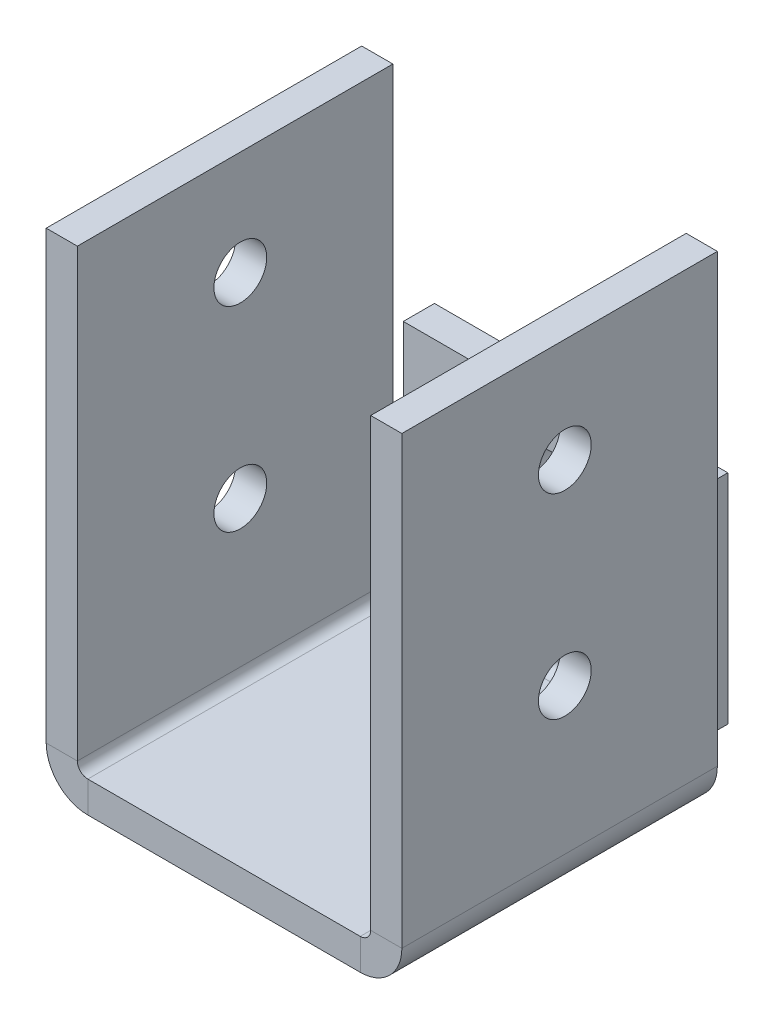
ISO-10303-21;
HEADER;
FILE_DESCRIPTION(('STEP AP214'),'2;1');
FILE_NAME('part.step','',(''),(''),'','','');
FILE_SCHEMA(('AUTOMOTIVE_DESIGN { 1 0 10303 214 1 1 1 1 }'));
ENDSEC;
DATA;
#1=APPLICATION_CONTEXT('core data for automotive mechanical design processes');
#2=APPLICATION_PROTOCOL_DEFINITION('international standard','automotive_design',2000,#1);
#3=PRODUCT_CONTEXT('',#1,'mechanical');
#4=PRODUCT('Part','Part','',(#3));
#5=PRODUCT_RELATED_PRODUCT_CATEGORY('part','',(#4));
#6=PRODUCT_DEFINITION_FORMATION('','',#4);
#7=PRODUCT_DEFINITION_CONTEXT('part definition',#1,'design');
#8=PRODUCT_DEFINITION('design','',#6,#7);
#9=PRODUCT_DEFINITION_SHAPE('','',#8);
#10=(LENGTH_UNIT() NAMED_UNIT(*) SI_UNIT(.MILLI.,.METRE.));
#11=(NAMED_UNIT(*) PLANE_ANGLE_UNIT() SI_UNIT($,.RADIAN.));
#12=(NAMED_UNIT(*) SI_UNIT($,.STERADIAN.) SOLID_ANGLE_UNIT());
#13=UNCERTAINTY_MEASURE_WITH_UNIT(LENGTH_MEASURE(1.E-05),#10,'distance_accuracy_value','');
#14=(GEOMETRIC_REPRESENTATION_CONTEXT(3) GLOBAL_UNCERTAINTY_ASSIGNED_CONTEXT((#13)) GLOBAL_UNIT_ASSIGNED_CONTEXT((#10,
#11,#12)) REPRESENTATION_CONTEXT('',''));
#15=CARTESIAN_POINT('',(0.,0.,0.));
#16=DIRECTION('',(0.,0.,1.));
#17=DIRECTION('',(1.,0.,0.));
#18=AXIS2_PLACEMENT_3D('',#15,#16,#17);
#19=CARTESIAN_POINT('',(0.,1.59999999999982,0.));
#20=DIRECTION('',(0.,1.,0.));
#21=DIRECTION('',(0.,0.,1.));
#22=AXIS2_PLACEMENT_3D('',#19,#20,#21);
#23=PLANE('',#22);
#24=DIRECTION('',(0.,0.,-1.));
#25=VECTOR('',#24,1.);
#26=CARTESIAN_POINT('',(-20.9,1.59999999999999,-25.));
#27=LINE('',#26,#25);
#28=CARTESIAN_POINT('',(-20.9,1.59999999999999,-25.));
#29=VERTEX_POINT('',#28);
#30=CARTESIAN_POINT('',(-20.9,1.60000000000003,-29.78));
#31=VERTEX_POINT('',#30);
#32=EDGE_CURVE('E12',#29,#31,#27,.T.);
#33=ORIENTED_EDGE('',*,*,#32,.F.);
#34=DIRECTION('',(-1.,0.,0.));
#35=VECTOR('',#34,1.);
#36=CARTESIAN_POINT('',(22.5,1.59999999999999,-25.));
#37=LINE('',#36,#35);
#38=CARTESIAN_POINT('',(-22.5,1.59999999999998,-25.));
#39=VERTEX_POINT('',#38);
#40=EDGE_CURVE('E288',#29,#39,#37,.T.);
#41=ORIENTED_EDGE('',*,*,#40,.T.);
#42=DIRECTION('',(0.,0.,-1.));
#43=VECTOR('',#42,1.);
#44=CARTESIAN_POINT('',(-22.5,1.59999999999999,-25.));
#45=LINE('',#44,#43);
#46=CARTESIAN_POINT('',(-22.5,1.60000000000003,-29.78));
#47=VERTEX_POINT('',#46);
#48=EDGE_CURVE('E286',#39,#47,#45,.T.);
#49=ORIENTED_EDGE('',*,*,#48,.T.);
#50=DIRECTION('',(1.,0.,0.));
#51=VECTOR('',#50,1.);
#52=CARTESIAN_POINT('',(0.,1.60000000000003,-29.78));
#53=LINE('',#52,#51);
#54=EDGE_CURVE('E293',#47,#31,#53,.T.);
#55=ORIENTED_EDGE('',*,*,#54,.T.);
#56=EDGE_LOOP('',(#33,#41,#49,#55));
#57=FACE_BOUND('',#56,.T.);
#58=ADVANCED_FACE('F40',(#57),#23,.F.);
#59=CARTESIAN_POINT('',(-22.5,1.59999999999998,-23.4));
#60=DIRECTION('',(-1.,0.,0.));
#61=DIRECTION('',(0.,0.,-1.));
#62=AXIS2_PLACEMENT_3D('',#59,#60,#61);
#63=CYLINDRICAL_SURFACE('',#62,6.38);
#64=DIRECTION('',(-1.,0.,0.));
#65=VECTOR('',#64,1.);
#66=CARTESIAN_POINT('',(-22.5,-4.78000000000002,-23.4));
#67=LINE('',#66,#65);
#68=CARTESIAN_POINT('',(-20.9,-4.78,-23.4));
#69=VERTEX_POINT('',#68);
#70=CARTESIAN_POINT('',(20.9,-4.78000000000002,-23.4));
#71=VERTEX_POINT('',#70);
#72=EDGE_CURVE('E317',#69,#71,#67,.F.);
#73=ORIENTED_EDGE('',*,*,#72,.F.);
#74=CARTESIAN_POINT('',(-20.9,1.59999999999998,-23.4));
#75=DIRECTION('',(-1.,0.,0.));
#76=DIRECTION('',(0.,0.,1.));
#77=AXIS2_PLACEMENT_3D('',#74,#75,#76);
#78=CIRCLE('',#77,6.38);
#79=EDGE_CURVE('E48',#69,#31,#78,.F.);
#80=ORIENTED_EDGE('',*,*,#79,.T.);
#81=CARTESIAN_POINT('',(20.9,1.60000000000003,-29.78));
#82=VERTEX_POINT('',#81);
#83=EDGE_CURVE('E296',#31,#82,#53,.T.);
#84=ORIENTED_EDGE('',*,*,#83,.T.);
#85=CARTESIAN_POINT('',(20.9,1.59999999999998,-23.4));
#86=DIRECTION('',(1.,0.,0.));
#87=DIRECTION('',(0.,0.,-1.));
#88=AXIS2_PLACEMENT_3D('',#85,#86,#87);
#89=CIRCLE('',#88,6.38);
#90=EDGE_CURVE('E324',#82,#71,#89,.F.);
#91=ORIENTED_EDGE('',*,*,#90,.T.);
#92=EDGE_LOOP('',(#73,#80,#84,#91));
#93=FACE_BOUND('',#92,.T.);
#94=ADVANCED_FACE('F394',(#93),#63,.T.);
#95=CARTESIAN_POINT('',(-20.9,1.59999999999998,-23.4));
#96=DIRECTION('',(-1.,0.,0.));
#97=DIRECTION('',(0.,0.,1.));
#98=AXIS2_PLACEMENT_3D('',#95,#96,#97);
#99=PLANE('',#98);
#100=CARTESIAN_POINT('',(-20.9,1.59999999999998,-23.4));
#101=DIRECTION('',(-1.,0.,0.));
#102=DIRECTION('',(0.,0.,1.));
#103=AXIS2_PLACEMENT_3D('',#100,#101,#102);
#104=CIRCLE('',#103,1.6);
#105=CARTESIAN_POINT('',(-20.9,0.,-23.4));
#106=VERTEX_POINT('',#105);
#107=EDGE_CURVE('E333',#106,#29,#104,.F.);
#108=ORIENTED_EDGE('',*,*,#107,.T.);
#109=ORIENTED_EDGE('',*,*,#32,.T.);
#110=ORIENTED_EDGE('',*,*,#79,.F.);
#111=DIRECTION('',(0.,-1.,0.));
#112=VECTOR('',#111,1.);
#113=CARTESIAN_POINT('',(-20.9,0.,-23.4));
#114=LINE('',#113,#112);
#115=EDGE_CURVE('E224',#106,#69,#114,.T.);
#116=ORIENTED_EDGE('',*,*,#115,.F.);
#117=EDGE_LOOP('',(#108,#109,#110,#116));
#118=FACE_BOUND('',#117,.T.);
#119=ADVANCED_FACE('F398',(#118),#99,.T.);
#120=CARTESIAN_POINT('',(0.,-4.78,0.));
#121=DIRECTION('',(0.,1.,0.));
#122=DIRECTION('',(0.,0.,1.));
#123=AXIS2_PLACEMENT_3D('',#120,#121,#122);
#124=PLANE('',#123);
#125=DIRECTION('',(0.,0.,1.));
#126=VECTOR('',#125,1.);
#127=CARTESIAN_POINT('',(-20.9,-4.78000000000001,25.));
#128=LINE('',#127,#126);
#129=CARTESIAN_POINT('',(-20.9,-4.78000000000001,25.));
#130=VERTEX_POINT('',#129);
#131=EDGE_CURVE('E170',#130,#69,#128,.F.);
#132=ORIENTED_EDGE('',*,*,#131,.T.);
#133=ORIENTED_EDGE('',*,*,#72,.T.);
#134=DIRECTION('',(0.,0.,-1.));
#135=VECTOR('',#134,1.);
#136=CARTESIAN_POINT('',(20.9,-4.78000000000002,-23.4));
#137=LINE('',#136,#135);
#138=CARTESIAN_POINT('',(20.9,-4.78,25.));
#139=VERTEX_POINT('',#138);
#140=EDGE_CURVE('E260',#71,#139,#137,.F.);
#141=ORIENTED_EDGE('',*,*,#140,.T.);
#142=DIRECTION('',(1.,0.,0.));
#143=VECTOR('',#142,1.);
#144=CARTESIAN_POINT('',(-22.5,-4.78,25.));
#145=LINE('',#144,#143);
#146=EDGE_CURVE('E322',#130,#139,#145,.T.);
#147=ORIENTED_EDGE('',*,*,#146,.F.);
#148=EDGE_LOOP('',(#132,#133,#141,#147));
#149=FACE_BOUND('',#148,.T.);
#150=ADVANCED_FACE('F404',(#149),#124,.F.);
#151=CARTESIAN_POINT('',(0.,0.,0.));
#152=DIRECTION('',(0.,1.,0.));
#153=DIRECTION('',(0.,0.,1.));
#154=AXIS2_PLACEMENT_3D('',#151,#152,#153);
#155=PLANE('',#154);
#156=DIRECTION('',(-1.,0.,0.));
#157=VECTOR('',#156,1.);
#158=CARTESIAN_POINT('',(-22.5,0.,-23.4));
#159=LINE('',#158,#157);
#160=CARTESIAN_POINT('',(20.9,0.,-23.4));
#161=VERTEX_POINT('',#160);
#162=EDGE_CURVE('E316',#106,#161,#159,.F.);
#163=ORIENTED_EDGE('',*,*,#162,.F.);
#164=DIRECTION('',(0.,0.,1.));
#165=VECTOR('',#164,1.);
#166=CARTESIAN_POINT('',(-20.9,0.,25.));
#167=LINE('',#166,#165);
#168=CARTESIAN_POINT('',(-20.9,0.,25.));
#169=VERTEX_POINT('',#168);
#170=EDGE_CURVE('E220',#169,#106,#167,.F.);
#171=ORIENTED_EDGE('',*,*,#170,.F.);
#172=DIRECTION('',(1.,0.,0.));
#173=VECTOR('',#172,1.);
#174=CARTESIAN_POINT('',(-22.5,0.,25.));
#175=LINE('',#174,#173);
#176=CARTESIAN_POINT('',(20.9,0.,25.));
#177=VERTEX_POINT('',#176);
#178=EDGE_CURVE('E320',#169,#177,#175,.T.);
#179=ORIENTED_EDGE('',*,*,#178,.T.);
#180=DIRECTION('',(0.,0.,-1.));
#181=VECTOR('',#180,1.);
#182=CARTESIAN_POINT('',(20.9,0.,-23.4));
#183=LINE('',#182,#181);
#184=EDGE_CURVE('E273',#161,#177,#183,.F.);
#185=ORIENTED_EDGE('',*,*,#184,.F.);
#186=EDGE_LOOP('',(#163,#171,#179,#185));
#187=FACE_BOUND('',#186,.T.);
#188=ADVANCED_FACE('F417',(#187),#155,.T.);
#189=CARTESIAN_POINT('',(-22.5,-4.78,25.));
#190=DIRECTION('',(0.,0.,1.));
#191=DIRECTION('',(1.,0.,0.));
#192=AXIS2_PLACEMENT_3D('',#189,#190,#191);
#193=PLANE('',#192);
#194=ORIENTED_EDGE('',*,*,#178,.F.);
#195=DIRECTION('',(0.,-1.,0.));
#196=VECTOR('',#195,1.);
#197=CARTESIAN_POINT('',(-20.9,0.,25.));
#198=LINE('',#197,#196);
#199=EDGE_CURVE('E216',#169,#130,#198,.T.);
#200=ORIENTED_EDGE('',*,*,#199,.T.);
#201=ORIENTED_EDGE('',*,*,#146,.T.);
#202=DIRECTION('',(0.,-1.,0.));
#203=VECTOR('',#202,1.);
#204=CARTESIAN_POINT('',(20.9,0.,25.));
#205=LINE('',#204,#203);
#206=EDGE_CURVE('E278',#177,#139,#205,.T.);
#207=ORIENTED_EDGE('',*,*,#206,.F.);
#208=EDGE_LOOP('',(#194,#200,#201,#207));
#209=FACE_BOUND('',#208,.T.);
#210=ADVANCED_FACE('F421',(#209),#193,.T.);
#211=CARTESIAN_POINT('',(0.,1.59999999999982,0.));
#212=DIRECTION('',(0.,1.,0.));
#213=DIRECTION('',(0.,0.,1.));
#214=AXIS2_PLACEMENT_3D('',#211,#212,#213);
#215=PLANE('',#214);
#216=DIRECTION('',(0.,0.,1.));
#217=VECTOR('',#216,1.);
#218=CARTESIAN_POINT('',(20.9,1.60000000000003,-29.78));
#219=LINE('',#218,#217);
#220=CARTESIAN_POINT('',(20.9,1.59999999999999,-25.));
#221=VERTEX_POINT('',#220);
#222=EDGE_CURVE('E331',#82,#221,#219,.T.);
#223=ORIENTED_EDGE('',*,*,#222,.F.);
#224=CARTESIAN_POINT('',(22.5,1.59999999999996,-29.78));
#225=VERTEX_POINT('',#224);
#226=EDGE_CURVE('E290',#82,#225,#53,.T.);
#227=ORIENTED_EDGE('',*,*,#226,.T.);
#228=DIRECTION('',(0.,0.,-1.));
#229=VECTOR('',#228,1.);
#230=CARTESIAN_POINT('',(22.5,1.59999999999999,-25.));
#231=LINE('',#230,#229);
#232=CARTESIAN_POINT('',(22.5,1.59999999999998,-25.));
#233=VERTEX_POINT('',#232);
#234=EDGE_CURVE('E281',#233,#225,#231,.T.);
#235=ORIENTED_EDGE('',*,*,#234,.F.);
#236=EDGE_CURVE('E283',#233,#221,#37,.T.);
#237=ORIENTED_EDGE('',*,*,#236,.T.);
#238=EDGE_LOOP('',(#223,#227,#235,#237));
#239=FACE_BOUND('',#238,.T.);
#240=ADVANCED_FACE('F425',(#239),#215,.F.);
#241=CARTESIAN_POINT('',(20.9,1.59999999999998,-23.4));
#242=DIRECTION('',(1.,0.,0.));
#243=DIRECTION('',(0.,0.,-1.));
#244=AXIS2_PLACEMENT_3D('',#241,#242,#243);
#245=PLANE('',#244);
#246=ORIENTED_EDGE('',*,*,#90,.F.);
#247=ORIENTED_EDGE('',*,*,#222,.T.);
#248=CARTESIAN_POINT('',(20.9,1.59999999999998,-23.4));
#249=DIRECTION('',(1.,0.,0.));
#250=DIRECTION('',(0.,0.,-1.));
#251=AXIS2_PLACEMENT_3D('',#248,#249,#250);
#252=CIRCLE('',#251,1.6);
#253=EDGE_CURVE('E328',#221,#161,#252,.F.);
#254=ORIENTED_EDGE('',*,*,#253,.T.);
#255=DIRECTION('',(0.,-1.,0.));
#256=VECTOR('',#255,1.);
#257=CARTESIAN_POINT('',(20.9,0.,-23.4));
#258=LINE('',#257,#256);
#259=EDGE_CURVE('E267',#161,#71,#258,.T.);
#260=ORIENTED_EDGE('',*,*,#259,.T.);
#261=EDGE_LOOP('',(#246,#247,#254,#260));
#262=FACE_BOUND('',#261,.T.);
#263=ADVANCED_FACE('F413',(#262),#245,.T.);
#264=CARTESIAN_POINT('',(-22.5,1.59999999999998,-23.4));
#265=DIRECTION('',(-1.,0.,0.));
#266=DIRECTION('',(0.,0.,-1.));
#267=AXIS2_PLACEMENT_3D('',#264,#265,#266);
#268=CYLINDRICAL_SURFACE('',#267,1.6);
#269=ORIENTED_EDGE('',*,*,#107,.F.);
#270=ORIENTED_EDGE('',*,*,#162,.T.);
#271=ORIENTED_EDGE('',*,*,#253,.F.);
#272=EDGE_CURVE('E287',#221,#29,#37,.T.);
#273=ORIENTED_EDGE('',*,*,#272,.T.);
#274=EDGE_LOOP('',(#269,#270,#271,#273));
#275=FACE_BOUND('',#274,.T.);
#276=ADVANCED_FACE('F410',(#275),#268,.F.);
#277=CARTESIAN_POINT('',(22.5,0.,-29.78));
#278=DIRECTION('',(-1.,0.,0.));
#279=DIRECTION('',(0.,0.,1.));
#280=AXIS2_PLACEMENT_3D('',#277,#278,#279);
#281=PLANE('',#280);
#282=ORIENTED_EDGE('',*,*,#234,.T.);
#283=DIRECTION('',(0.,-1.,0.));
#284=VECTOR('',#283,1.);
#285=CARTESIAN_POINT('',(22.5,0.,-29.78));
#286=LINE('',#285,#284);
#287=CARTESIAN_POINT('',(22.5,35.,-29.7800000000001));
#288=VERTEX_POINT('',#287);
#289=EDGE_CURVE('E297',#288,#225,#286,.T.);
#290=ORIENTED_EDGE('',*,*,#289,.F.);
#291=DIRECTION('',(0.,0.,1.));
#292=VECTOR('',#291,1.);
#293=CARTESIAN_POINT('',(22.5,35.,-29.7800000000001));
#294=LINE('',#293,#292);
#295=CARTESIAN_POINT('',(22.5,35.,-25.0000000000001));
#296=VERTEX_POINT('',#295);
#297=EDGE_CURVE('E305',#288,#296,#294,.T.);
#298=ORIENTED_EDGE('',*,*,#297,.T.);
#299=DIRECTION('',(0.,-1.,0.));
#300=VECTOR('',#299,1.);
#301=CARTESIAN_POINT('',(22.5,0.,-25.));
#302=LINE('',#301,#300);
#303=EDGE_CURVE('E295',#296,#233,#302,.T.);
#304=ORIENTED_EDGE('',*,*,#303,.T.);
#305=EDGE_LOOP('',(#282,#290,#298,#304));
#306=FACE_BOUND('',#305,.T.);
#307=ADVANCED_FACE('F408',(#306),#281,.F.);
#308=CARTESIAN_POINT('',(-22.5,35.,-29.7800000000001));
#309=DIRECTION('',(1.,0.,0.));
#310=DIRECTION('',(0.,0.,-1.));
#311=AXIS2_PLACEMENT_3D('',#308,#309,#310);
#312=PLANE('',#311);
#313=ORIENTED_EDGE('',*,*,#48,.F.);
#314=DIRECTION('',(0.,1.,0.));
#315=VECTOR('',#314,1.);
#316=CARTESIAN_POINT('',(-22.5,35.,-25.0000000000001));
#317=LINE('',#316,#315);
#318=CARTESIAN_POINT('',(-22.5,35.,-25.0000000000001));
#319=VERTEX_POINT('',#318);
#320=EDGE_CURVE('E308',#39,#319,#317,.T.);
#321=ORIENTED_EDGE('',*,*,#320,.T.);
#322=DIRECTION('',(0.,0.,1.));
#323=VECTOR('',#322,1.);
#324=CARTESIAN_POINT('',(-22.5,35.,-29.7800000000001));
#325=LINE('',#324,#323);
#326=CARTESIAN_POINT('',(-22.5,35.,-29.7800000000001));
#327=VERTEX_POINT('',#326);
#328=EDGE_CURVE('E313',#327,#319,#325,.T.);
#329=ORIENTED_EDGE('',*,*,#328,.F.);
#330=DIRECTION('',(0.,1.,0.));
#331=VECTOR('',#330,1.);
#332=CARTESIAN_POINT('',(-22.5,35.,-29.7800000000001));
#333=LINE('',#332,#331);
#334=EDGE_CURVE('E300',#47,#327,#333,.T.);
#335=ORIENTED_EDGE('',*,*,#334,.F.);
#336=EDGE_LOOP('',(#313,#321,#329,#335));
#337=FACE_BOUND('',#336,.T.);
#338=ADVANCED_FACE('F461',(#337),#312,.F.);
#339=CARTESIAN_POINT('',(0.,-1.03425454598511E-13,-29.78));
#340=DIRECTION('',(0.,0.,1.));
#341=DIRECTION('',(0.,-1.,0.));
#342=AXIS2_PLACEMENT_3D('',#339,#340,#341);
#343=PLANE('',#342);
#344=CARTESIAN_POINT('',(0.,25.,-29.7800000000001));
#345=DIRECTION('',(0.,0.,-1.));
#346=DIRECTION('',(0.,1.,0.));
#347=AXIS2_PLACEMENT_3D('',#344,#345,#346);
#348=CIRCLE('',#347,4.05);
#349=CARTESIAN_POINT('',(0.,29.05,-29.7800000000001));
#350=VERTEX_POINT('',#349);
#351=EDGE_CURVE('E555',#350,#350,#348,.T.);
#352=ORIENTED_EDGE('',*,*,#351,.F.);
#353=EDGE_LOOP('',(#352));
#354=FACE_BOUND('',#353,.T.);
#355=CARTESIAN_POINT('',(0.,9.99999999999999,-29.78));
#356=DIRECTION('',(0.,0.,-1.));
#357=DIRECTION('',(0.,1.,0.));
#358=AXIS2_PLACEMENT_3D('',#355,#356,#357);
#359=CIRCLE('',#358,4.05);
#360=CARTESIAN_POINT('',(0.,14.05,-29.7800000000001));
#361=VERTEX_POINT('',#360);
#362=EDGE_CURVE('E562',#361,#361,#359,.T.);
#363=ORIENTED_EDGE('',*,*,#362,.F.);
#364=EDGE_LOOP('',(#363));
#365=FACE_BOUND('',#364,.T.);
#366=ORIENTED_EDGE('',*,*,#54,.F.);
#367=ORIENTED_EDGE('',*,*,#334,.T.);
#368=DIRECTION('',(1.,0.,0.));
#369=VECTOR('',#368,1.);
#370=CARTESIAN_POINT('',(22.5,35.,-29.7800000000001));
#371=LINE('',#370,#369);
#372=EDGE_CURVE('E303',#327,#288,#371,.T.);
#373=ORIENTED_EDGE('',*,*,#372,.T.);
#374=ORIENTED_EDGE('',*,*,#289,.T.);
#375=ORIENTED_EDGE('',*,*,#226,.F.);
#376=ORIENTED_EDGE('',*,*,#83,.F.);
#377=EDGE_LOOP('',(#366,#367,#373,#374,#375,#376));
#378=FACE_BOUND('',#377,.T.);
#379=ADVANCED_FACE('F443',(#354,#365,#378),#343,.F.);
#380=CARTESIAN_POINT('',(0.,0.,-25.));
#381=DIRECTION('',(0.,0.,1.));
#382=DIRECTION('',(0.,-1.,0.));
#383=AXIS2_PLACEMENT_3D('',#380,#381,#382);
#384=PLANE('',#383);
#385=CARTESIAN_POINT('',(0.,25.,-25.0000000000001));
#386=DIRECTION('',(0.,0.,1.));
#387=DIRECTION('',(0.,-1.,0.));
#388=AXIS2_PLACEMENT_3D('',#385,#386,#387);
#389=CIRCLE('',#388,4.05);
#390=CARTESIAN_POINT('',(0.,20.95,-25.0000000000001));
#391=VERTEX_POINT('',#390);
#392=EDGE_CURVE('E356',#391,#391,#389,.F.);
#393=ORIENTED_EDGE('',*,*,#392,.T.);
#394=EDGE_LOOP('',(#393));
#395=FACE_BOUND('',#394,.T.);
#396=CARTESIAN_POINT('',(0.,10.,-25.));
#397=DIRECTION('',(0.,0.,1.));
#398=DIRECTION('',(0.,-1.,0.));
#399=AXIS2_PLACEMENT_3D('',#396,#397,#398);
#400=CIRCLE('',#399,4.05);
#401=CARTESIAN_POINT('',(0.,5.95,-25.));
#402=VERTEX_POINT('',#401);
#403=EDGE_CURVE('E559',#402,#402,#400,.F.);
#404=ORIENTED_EDGE('',*,*,#403,.T.);
#405=EDGE_LOOP('',(#404));
#406=FACE_BOUND('',#405,.T.);
#407=ORIENTED_EDGE('',*,*,#320,.F.);
#408=ORIENTED_EDGE('',*,*,#40,.F.);
#409=ORIENTED_EDGE('',*,*,#272,.F.);
#410=ORIENTED_EDGE('',*,*,#236,.F.);
#411=ORIENTED_EDGE('',*,*,#303,.F.);
#412=DIRECTION('',(1.,0.,0.));
#413=VECTOR('',#412,1.);
#414=CARTESIAN_POINT('',(22.5,35.,-25.0000000000001));
#415=LINE('',#414,#413);
#416=EDGE_CURVE('E301',#319,#296,#415,.T.);
#417=ORIENTED_EDGE('',*,*,#416,.F.);
#418=EDGE_LOOP('',(#407,#408,#409,#410,#411,#417));
#419=FACE_BOUND('',#418,.T.);
#420=ADVANCED_FACE('F456',(#395,#406,#419),#384,.T.);
#421=CARTESIAN_POINT('',(22.5,35.,-29.7800000000001));
#422=DIRECTION('',(0.,-1.,0.));
#423=DIRECTION('',(0.,0.,-1.));
#424=AXIS2_PLACEMENT_3D('',#421,#422,#423);
#425=PLANE('',#424);
#426=ORIENTED_EDGE('',*,*,#416,.T.);
#427=ORIENTED_EDGE('',*,*,#297,.F.);
#428=ORIENTED_EDGE('',*,*,#372,.F.);
#429=ORIENTED_EDGE('',*,*,#328,.T.);
#430=EDGE_LOOP('',(#426,#427,#428,#429));
#431=FACE_BOUND('',#430,.T.);
#432=ADVANCED_FACE('F466',(#431),#425,.F.);
#433=CARTESIAN_POINT('',(20.9,1.6,25.));
#434=DIRECTION('',(0.,0.,1.));
#435=DIRECTION('',(0.,-1.,0.));
#436=AXIS2_PLACEMENT_3D('',#433,#434,#435);
#437=PLANE('',#436);
#438=DIRECTION('',(1.,0.,0.));
#439=VECTOR('',#438,1.);
#440=CARTESIAN_POINT('',(22.5,1.59999999999999,25.));
#441=LINE('',#440,#439);
#442=CARTESIAN_POINT('',(22.5,1.59999999999999,25.));
#443=VERTEX_POINT('',#442);
#444=CARTESIAN_POINT('',(27.28,1.59999999999998,25.));
#445=VERTEX_POINT('',#444);
#446=EDGE_CURVE('E227',#443,#445,#441,.T.);
#447=ORIENTED_EDGE('',*,*,#446,.F.);
#448=CARTESIAN_POINT('',(20.9,1.6,25.));
#449=DIRECTION('',(0.,0.,-1.));
#450=DIRECTION('',(0.,1.,0.));
#451=AXIS2_PLACEMENT_3D('',#448,#449,#450);
#452=CIRCLE('',#451,1.6);
#453=EDGE_CURVE('E270',#177,#443,#452,.F.);
#454=ORIENTED_EDGE('',*,*,#453,.F.);
#455=ORIENTED_EDGE('',*,*,#206,.T.);
#456=CARTESIAN_POINT('',(20.9,1.6,25.));
#457=DIRECTION('',(0.,0.,-1.));
#458=DIRECTION('',(0.,1.,0.));
#459=AXIS2_PLACEMENT_3D('',#456,#457,#458);
#460=CIRCLE('',#459,6.38);
#461=EDGE_CURVE('E263',#139,#445,#460,.F.);
#462=ORIENTED_EDGE('',*,*,#461,.T.);
#463=EDGE_LOOP('',(#447,#454,#455,#462));
#464=FACE_BOUND('',#463,.T.);
#465=ADVANCED_FACE('F481',(#464),#437,.T.);
#466=CARTESIAN_POINT('',(20.9,1.59999999999998,-23.4));
#467=DIRECTION('',(0.,0.,1.));
#468=DIRECTION('',(0.,-1.,0.));
#469=AXIS2_PLACEMENT_3D('',#466,#467,#468);
#470=PLANE('',#469);
#471=CARTESIAN_POINT('',(20.9,1.59999999999998,-23.4));
#472=DIRECTION('',(0.,0.,-1.));
#473=DIRECTION('',(0.,1.,0.));
#474=AXIS2_PLACEMENT_3D('',#471,#472,#473);
#475=CIRCLE('',#474,1.6);
#476=CARTESIAN_POINT('',(22.5,1.59999999999997,-23.4));
#477=VERTEX_POINT('',#476);
#478=EDGE_CURVE('E259',#477,#161,#475,.T.);
#479=ORIENTED_EDGE('',*,*,#478,.F.);
#480=DIRECTION('',(1.,0.,0.));
#481=VECTOR('',#480,1.);
#482=CARTESIAN_POINT('',(22.5,1.59999999999997,-23.4));
#483=LINE('',#482,#481);
#484=CARTESIAN_POINT('',(27.28,1.59999999999995,-23.4));
#485=VERTEX_POINT('',#484);
#486=EDGE_CURVE('E232',#477,#485,#483,.T.);
#487=ORIENTED_EDGE('',*,*,#486,.T.);
#488=CARTESIAN_POINT('',(20.9,1.59999999999998,-23.4));
#489=DIRECTION('',(0.,0.,-1.));
#490=DIRECTION('',(0.,1.,0.));
#491=AXIS2_PLACEMENT_3D('',#488,#489,#490);
#492=CIRCLE('',#491,6.38);
#493=EDGE_CURVE('E264',#485,#71,#492,.T.);
#494=ORIENTED_EDGE('',*,*,#493,.T.);
#495=ORIENTED_EDGE('',*,*,#259,.F.);
#496=EDGE_LOOP('',(#479,#487,#494,#495));
#497=FACE_BOUND('',#496,.T.);
#498=ADVANCED_FACE('F485',(#497),#470,.F.);
#499=CARTESIAN_POINT('',(20.9,1.59999999999998,-23.4));
#500=DIRECTION('',(0.,0.,-1.));
#501=DIRECTION('',(1.,0.,0.));
#502=AXIS2_PLACEMENT_3D('',#499,#500,#501);
#503=CYLINDRICAL_SURFACE('',#502,6.38);
#504=ORIENTED_EDGE('',*,*,#140,.F.);
#505=ORIENTED_EDGE('',*,*,#493,.F.);
#506=DIRECTION('',(0.,0.,1.));
#507=VECTOR('',#506,1.);
#508=CARTESIAN_POINT('',(27.28,1.59999999999996,0.));
#509=LINE('',#508,#507);
#510=EDGE_CURVE('E235',#485,#445,#509,.T.);
#511=ORIENTED_EDGE('',*,*,#510,.T.);
#512=ORIENTED_EDGE('',*,*,#461,.F.);
#513=EDGE_LOOP('',(#504,#505,#511,#512));
#514=FACE_BOUND('',#513,.T.);
#515=ADVANCED_FACE('F488',(#514),#503,.T.);
#516=CARTESIAN_POINT('',(20.9,1.59999999999998,-23.4));
#517=DIRECTION('',(0.,0.,-1.));
#518=DIRECTION('',(1.,0.,0.));
#519=AXIS2_PLACEMENT_3D('',#516,#517,#518);
#520=CYLINDRICAL_SURFACE('',#519,1.6);
#521=ORIENTED_EDGE('',*,*,#184,.T.);
#522=ORIENTED_EDGE('',*,*,#453,.T.);
#523=DIRECTION('',(0.,0.,-1.));
#524=VECTOR('',#523,1.);
#525=CARTESIAN_POINT('',(22.5,1.59999999999999,25.));
#526=LINE('',#525,#524);
#527=EDGE_CURVE('E230',#443,#477,#526,.T.);
#528=ORIENTED_EDGE('',*,*,#527,.T.);
#529=ORIENTED_EDGE('',*,*,#478,.T.);
#530=EDGE_LOOP('',(#521,#522,#528,#529));
#531=FACE_BOUND('',#530,.T.);
#532=ADVANCED_FACE('F493',(#531),#520,.F.);
#533=CARTESIAN_POINT('',(27.2800000000002,70.,-23.4));
#534=DIRECTION('',(0.,0.,1.));
#535=DIRECTION('',(0.,-1.,0.));
#536=AXIS2_PLACEMENT_3D('',#533,#534,#535);
#537=PLANE('',#536);
#538=ORIENTED_EDGE('',*,*,#486,.F.);
#539=DIRECTION('',(0.,1.,0.));
#540=VECTOR('',#539,1.);
#541=CARTESIAN_POINT('',(22.5000000000002,70.,-23.4));
#542=LINE('',#541,#540);
#543=CARTESIAN_POINT('',(22.5000000000002,70.,-23.4));
#544=VERTEX_POINT('',#543);
#545=EDGE_CURVE('E239',#477,#544,#542,.T.);
#546=ORIENTED_EDGE('',*,*,#545,.T.);
#547=DIRECTION('',(-1.,0.,0.));
#548=VECTOR('',#547,1.);
#549=CARTESIAN_POINT('',(27.2800000000002,70.,-23.4));
#550=LINE('',#549,#548);
#551=CARTESIAN_POINT('',(27.2800000000002,70.,-23.4));
#552=VERTEX_POINT('',#551);
#553=EDGE_CURVE('E256',#552,#544,#550,.T.);
#554=ORIENTED_EDGE('',*,*,#553,.F.);
#555=DIRECTION('',(0.,1.,0.));
#556=VECTOR('',#555,1.);
#557=CARTESIAN_POINT('',(27.2800000000002,70.,-23.4));
#558=LINE('',#557,#556);
#559=EDGE_CURVE('E240',#485,#552,#558,.T.);
#560=ORIENTED_EDGE('',*,*,#559,.F.);
#561=EDGE_LOOP('',(#538,#546,#554,#560));
#562=FACE_BOUND('',#561,.T.);
#563=ADVANCED_FACE('F496',(#562),#537,.F.);
#564=CARTESIAN_POINT('',(27.28,0.,25.));
#565=DIRECTION('',(0.,0.,-1.));
#566=DIRECTION('',(0.,1.,0.));
#567=AXIS2_PLACEMENT_3D('',#564,#565,#566);
#568=PLANE('',#567);
#569=ORIENTED_EDGE('',*,*,#446,.T.);
#570=DIRECTION('',(0.,-1.,0.));
#571=VECTOR('',#570,1.);
#572=CARTESIAN_POINT('',(27.28,0.,25.));
#573=LINE('',#572,#571);
#574=CARTESIAN_POINT('',(27.2800000000002,70.,25.));
#575=VERTEX_POINT('',#574);
#576=EDGE_CURVE('E245',#575,#445,#573,.T.);
#577=ORIENTED_EDGE('',*,*,#576,.F.);
#578=DIRECTION('',(-1.,0.,0.));
#579=VECTOR('',#578,1.);
#580=CARTESIAN_POINT('',(27.2800000000002,70.,25.));
#581=LINE('',#580,#579);
#582=CARTESIAN_POINT('',(22.5000000000002,70.,25.));
#583=VERTEX_POINT('',#582);
#584=EDGE_CURVE('E248',#575,#583,#581,.T.);
#585=ORIENTED_EDGE('',*,*,#584,.T.);
#586=DIRECTION('',(0.,-1.,0.));
#587=VECTOR('',#586,1.);
#588=CARTESIAN_POINT('',(22.5,0.,25.));
#589=LINE('',#588,#587);
#590=EDGE_CURVE('E243',#583,#443,#589,.T.);
#591=ORIENTED_EDGE('',*,*,#590,.T.);
#592=EDGE_LOOP('',(#569,#577,#585,#591));
#593=FACE_BOUND('',#592,.T.);
#594=ADVANCED_FACE('F503',(#593),#568,.F.);
#595=CARTESIAN_POINT('',(27.28,0.,0.));
#596=DIRECTION('',(-1.,0.,0.));
#597=DIRECTION('',(0.,-1.,0.));
#598=AXIS2_PLACEMENT_3D('',#595,#596,#597);
#599=PLANE('',#598);
#600=CARTESIAN_POINT('',(27.2800000000002,54.,0.));
#601=DIRECTION('',(1.,0.,0.));
#602=DIRECTION('',(0.,1.,0.));
#603=AXIS2_PLACEMENT_3D('',#600,#601,#602);
#604=CIRCLE('',#603,4.05);
#605=CARTESIAN_POINT('',(27.2800000000002,58.05,0.));
#606=VERTEX_POINT('',#605);
#607=EDGE_CURVE('E344',#606,#606,#604,.T.);
#608=ORIENTED_EDGE('',*,*,#607,.F.);
#609=EDGE_LOOP('',(#608));
#610=FACE_BOUND('',#609,.T.);
#611=CARTESIAN_POINT('',(27.2800000000001,24.,0.));
#612=DIRECTION('',(1.,0.,0.));
#613=DIRECTION('',(0.,1.,0.));
#614=AXIS2_PLACEMENT_3D('',#611,#612,#613);
#615=CIRCLE('',#614,4.05);
#616=CARTESIAN_POINT('',(27.2800000000001,28.05,0.));
#617=VERTEX_POINT('',#616);
#618=EDGE_CURVE('E353',#617,#617,#615,.T.);
#619=ORIENTED_EDGE('',*,*,#618,.F.);
#620=EDGE_LOOP('',(#619));
#621=FACE_BOUND('',#620,.T.);
#622=ORIENTED_EDGE('',*,*,#510,.F.);
#623=ORIENTED_EDGE('',*,*,#559,.T.);
#624=DIRECTION('',(0.,0.,1.));
#625=VECTOR('',#624,1.);
#626=CARTESIAN_POINT('',(27.2800000000002,70.,25.));
#627=LINE('',#626,#625);
#628=EDGE_CURVE('E242',#552,#575,#627,.T.);
#629=ORIENTED_EDGE('',*,*,#628,.T.);
#630=ORIENTED_EDGE('',*,*,#576,.T.);
#631=EDGE_LOOP('',(#622,#623,#629,#630));
#632=FACE_BOUND('',#631,.T.);
#633=ADVANCED_FACE('F512',(#610,#621,#632),#599,.F.);
#634=CARTESIAN_POINT('',(22.5,0.,0.));
#635=DIRECTION('',(-1.,0.,0.));
#636=DIRECTION('',(0.,-1.,0.));
#637=AXIS2_PLACEMENT_3D('',#634,#635,#636);
#638=PLANE('',#637);
#639=CARTESIAN_POINT('',(22.5000000000002,54.,0.));
#640=DIRECTION('',(-1.,0.,0.));
#641=DIRECTION('',(0.,-1.,0.));
#642=AXIS2_PLACEMENT_3D('',#639,#640,#641);
#643=CIRCLE('',#642,4.05);
#644=CARTESIAN_POINT('',(22.5000000000002,49.95,0.));
#645=VERTEX_POINT('',#644);
#646=EDGE_CURVE('E359',#645,#645,#643,.T.);
#647=ORIENTED_EDGE('',*,*,#646,.F.);
#648=EDGE_LOOP('',(#647));
#649=FACE_BOUND('',#648,.T.);
#650=CARTESIAN_POINT('',(22.5000000000001,24.,0.));
#651=DIRECTION('',(-1.,0.,0.));
#652=DIRECTION('',(0.,-1.,0.));
#653=AXIS2_PLACEMENT_3D('',#650,#651,#652);
#654=CIRCLE('',#653,4.05);
#655=CARTESIAN_POINT('',(22.5000000000001,19.95,0.));
#656=VERTEX_POINT('',#655);
#657=EDGE_CURVE('E337',#656,#656,#654,.T.);
#658=ORIENTED_EDGE('',*,*,#657,.F.);
#659=EDGE_LOOP('',(#658));
#660=FACE_BOUND('',#659,.T.);
#661=ORIENTED_EDGE('',*,*,#545,.F.);
#662=ORIENTED_EDGE('',*,*,#527,.F.);
#663=ORIENTED_EDGE('',*,*,#590,.F.);
#664=DIRECTION('',(0.,0.,1.));
#665=VECTOR('',#664,1.);
#666=CARTESIAN_POINT('',(22.5000000000002,70.,25.));
#667=LINE('',#666,#665);
#668=EDGE_CURVE('E250',#544,#583,#667,.T.);
#669=ORIENTED_EDGE('',*,*,#668,.F.);
#670=EDGE_LOOP('',(#661,#662,#663,#669));
#671=FACE_BOUND('',#670,.T.);
#672=ADVANCED_FACE('F508',(#649,#660,#671),#638,.T.);
#673=CARTESIAN_POINT('',(27.2800000000002,70.,25.));
#674=DIRECTION('',(0.,-1.,0.));
#675=DIRECTION('',(1.,0.,0.));
#676=AXIS2_PLACEMENT_3D('',#673,#674,#675);
#677=PLANE('',#676);
#678=ORIENTED_EDGE('',*,*,#668,.T.);
#679=ORIENTED_EDGE('',*,*,#584,.F.);
#680=ORIENTED_EDGE('',*,*,#628,.F.);
#681=ORIENTED_EDGE('',*,*,#553,.T.);
#682=EDGE_LOOP('',(#678,#679,#680,#681));
#683=FACE_BOUND('',#682,.T.);
#684=ADVANCED_FACE('F505',(#683),#677,.F.);
#685=CARTESIAN_POINT('',(-20.9,1.6,-23.4));
#686=DIRECTION('',(0.,0.,-1.));
#687=DIRECTION('',(0.,1.,0.));
#688=AXIS2_PLACEMENT_3D('',#685,#686,#687);
#689=PLANE('',#688);
#690=DIRECTION('',(-1.,0.,0.));
#691=VECTOR('',#690,1.);
#692=CARTESIAN_POINT('',(-22.5,1.59999999999999,-23.4));
#693=LINE('',#692,#691);
#694=CARTESIAN_POINT('',(-22.5,1.59999999999999,-23.4));
#695=VERTEX_POINT('',#694);
#696=CARTESIAN_POINT('',(-27.28,1.59999999999998,-23.4));
#697=VERTEX_POINT('',#696);
#698=EDGE_CURVE('E362',#695,#697,#693,.T.);
#699=ORIENTED_EDGE('',*,*,#698,.F.);
#700=CARTESIAN_POINT('',(-20.9,1.6,-23.4));
#701=DIRECTION('',(0.,0.,1.));
#702=DIRECTION('',(0.,-1.,0.));
#703=AXIS2_PLACEMENT_3D('',#700,#701,#702);
#704=CIRCLE('',#703,1.6);
#705=EDGE_CURVE('E173',#106,#695,#704,.F.);
#706=ORIENTED_EDGE('',*,*,#705,.F.);
#707=ORIENTED_EDGE('',*,*,#115,.T.);
#708=CARTESIAN_POINT('',(-20.9,1.6,-23.4));
#709=DIRECTION('',(0.,0.,1.));
#710=DIRECTION('',(0.,-1.,0.));
#711=AXIS2_PLACEMENT_3D('',#708,#709,#710);
#712=CIRCLE('',#711,6.38);
#713=EDGE_CURVE('E215',#69,#697,#712,.F.);
#714=ORIENTED_EDGE('',*,*,#713,.T.);
#715=EDGE_LOOP('',(#699,#706,#707,#714));
#716=FACE_BOUND('',#715,.T.);
#717=ADVANCED_FACE('F370',(#716),#689,.T.);
#718=CARTESIAN_POINT('',(-20.9,1.59999999999999,25.));
#719=DIRECTION('',(0.,0.,-1.));
#720=DIRECTION('',(0.,1.,0.));
#721=AXIS2_PLACEMENT_3D('',#718,#719,#720);
#722=PLANE('',#721);
#723=CARTESIAN_POINT('',(-20.9,1.59999999999999,25.));
#724=DIRECTION('',(0.,0.,1.));
#725=DIRECTION('',(0.,-1.,0.));
#726=AXIS2_PLACEMENT_3D('',#723,#724,#725);
#727=CIRCLE('',#726,1.6);
#728=CARTESIAN_POINT('',(-22.5,1.59999999999999,25.));
#729=VERTEX_POINT('',#728);
#730=EDGE_CURVE('E180',#729,#169,#727,.T.);
#731=ORIENTED_EDGE('',*,*,#730,.F.);
#732=DIRECTION('',(-1.,0.,0.));
#733=VECTOR('',#732,1.);
#734=CARTESIAN_POINT('',(-22.5,1.59999999999999,25.));
#735=LINE('',#734,#733);
#736=CARTESIAN_POINT('',(-27.28,1.59999999999997,25.));
#737=VERTEX_POINT('',#736);
#738=EDGE_CURVE('E177',#729,#737,#735,.T.);
#739=ORIENTED_EDGE('',*,*,#738,.T.);
#740=CARTESIAN_POINT('',(-20.9,1.59999999999999,25.));
#741=DIRECTION('',(0.,0.,1.));
#742=DIRECTION('',(0.,-1.,0.));
#743=AXIS2_PLACEMENT_3D('',#740,#741,#742);
#744=CIRCLE('',#743,6.38);
#745=EDGE_CURVE('E162',#737,#130,#744,.T.);
#746=ORIENTED_EDGE('',*,*,#745,.T.);
#747=ORIENTED_EDGE('',*,*,#199,.F.);
#748=EDGE_LOOP('',(#731,#739,#746,#747));
#749=FACE_BOUND('',#748,.T.);
#750=ADVANCED_FACE('F178',(#749),#722,.F.);
#751=CARTESIAN_POINT('',(-20.9,1.59999999999999,25.));
#752=DIRECTION('',(0.,0.,1.));
#753=DIRECTION('',(-1.,0.,0.));
#754=AXIS2_PLACEMENT_3D('',#751,#752,#753);
#755=CYLINDRICAL_SURFACE('',#754,6.38);
#756=ORIENTED_EDGE('',*,*,#131,.F.);
#757=ORIENTED_EDGE('',*,*,#745,.F.);
#758=DIRECTION('',(0.,0.,-1.));
#759=VECTOR('',#758,1.);
#760=CARTESIAN_POINT('',(-27.28,1.59999999999997,0.));
#761=LINE('',#760,#759);
#762=EDGE_CURVE('E167',#737,#697,#761,.T.);
#763=ORIENTED_EDGE('',*,*,#762,.T.);
#764=ORIENTED_EDGE('',*,*,#713,.F.);
#765=EDGE_LOOP('',(#756,#757,#763,#764));
#766=FACE_BOUND('',#765,.T.);
#767=ADVANCED_FACE('F164',(#766),#755,.T.);
#768=CARTESIAN_POINT('',(-20.9,1.59999999999999,25.));
#769=DIRECTION('',(0.,0.,1.));
#770=DIRECTION('',(-1.,0.,0.));
#771=AXIS2_PLACEMENT_3D('',#768,#769,#770);
#772=CYLINDRICAL_SURFACE('',#771,1.6);
#773=ORIENTED_EDGE('',*,*,#170,.T.);
#774=ORIENTED_EDGE('',*,*,#705,.T.);
#775=DIRECTION('',(0.,0.,1.));
#776=VECTOR('',#775,1.);
#777=CARTESIAN_POINT('',(-22.5,1.59999999999999,-23.4));
#778=LINE('',#777,#776);
#779=EDGE_CURVE('E184',#695,#729,#778,.T.);
#780=ORIENTED_EDGE('',*,*,#779,.T.);
#781=ORIENTED_EDGE('',*,*,#730,.T.);
#782=EDGE_LOOP('',(#773,#774,#780,#781));
#783=FACE_BOUND('',#782,.T.);
#784=ADVANCED_FACE('F373',(#783),#772,.F.);
#785=CARTESIAN_POINT('',(-27.28,0.,-23.4));
#786=DIRECTION('',(0.,0.,1.));
#787=DIRECTION('',(1.,0.,0.));
#788=AXIS2_PLACEMENT_3D('',#785,#786,#787);
#789=PLANE('',#788);
#790=ORIENTED_EDGE('',*,*,#698,.T.);
#791=DIRECTION('',(0.,-1.,0.));
#792=VECTOR('',#791,1.);
#793=CARTESIAN_POINT('',(-27.28,0.,-23.4));
#794=LINE('',#793,#792);
#795=CARTESIAN_POINT('',(-27.2800000000002,70.,-23.4));
#796=VERTEX_POINT('',#795);
#797=EDGE_CURVE('E192',#796,#697,#794,.T.);
#798=ORIENTED_EDGE('',*,*,#797,.F.);
#799=DIRECTION('',(1.,0.,0.));
#800=VECTOR('',#799,1.);
#801=CARTESIAN_POINT('',(-27.2800000000002,70.,-23.4));
#802=LINE('',#801,#800);
#803=CARTESIAN_POINT('',(-22.5000000000002,70.,-23.4));
#804=VERTEX_POINT('',#803);
#805=EDGE_CURVE('E201',#796,#804,#802,.T.);
#806=ORIENTED_EDGE('',*,*,#805,.T.);
#807=DIRECTION('',(0.,-1.,0.));
#808=VECTOR('',#807,1.);
#809=CARTESIAN_POINT('',(-22.5,0.,-23.4));
#810=LINE('',#809,#808);
#811=EDGE_CURVE('E193',#804,#695,#810,.T.);
#812=ORIENTED_EDGE('',*,*,#811,.T.);
#813=EDGE_LOOP('',(#790,#798,#806,#812));
#814=FACE_BOUND('',#813,.T.);
#815=ADVANCED_FACE('F366',(#814),#789,.F.);
#816=CARTESIAN_POINT('',(-27.2800000000002,70.,25.));
#817=DIRECTION('',(0.,0.,-1.));
#818=DIRECTION('',(-1.,0.,0.));
#819=AXIS2_PLACEMENT_3D('',#816,#817,#818);
#820=PLANE('',#819);
#821=ORIENTED_EDGE('',*,*,#738,.F.);
#822=DIRECTION('',(0.,1.,0.));
#823=VECTOR('',#822,1.);
#824=CARTESIAN_POINT('',(-22.5000000000002,70.,25.));
#825=LINE('',#824,#823);
#826=CARTESIAN_POINT('',(-22.5000000000002,70.,25.));
#827=VERTEX_POINT('',#826);
#828=EDGE_CURVE('E208',#729,#827,#825,.T.);
#829=ORIENTED_EDGE('',*,*,#828,.T.);
#830=DIRECTION('',(1.,0.,0.));
#831=VECTOR('',#830,1.);
#832=CARTESIAN_POINT('',(-27.2800000000002,70.,25.));
#833=LINE('',#832,#831);
#834=CARTESIAN_POINT('',(-27.2800000000002,70.,25.));
#835=VERTEX_POINT('',#834);
#836=EDGE_CURVE('E197',#835,#827,#833,.T.);
#837=ORIENTED_EDGE('',*,*,#836,.F.);
#838=DIRECTION('',(0.,1.,0.));
#839=VECTOR('',#838,1.);
#840=CARTESIAN_POINT('',(-27.2800000000002,70.,25.));
#841=LINE('',#840,#839);
#842=EDGE_CURVE('E189',#737,#835,#841,.T.);
#843=ORIENTED_EDGE('',*,*,#842,.F.);
#844=EDGE_LOOP('',(#821,#829,#837,#843));
#845=FACE_BOUND('',#844,.T.);
#846=ADVANCED_FACE('F195',(#845),#820,.F.);
#847=CARTESIAN_POINT('',(-27.28,0.,0.));
#848=DIRECTION('',(1.,0.,0.));
#849=DIRECTION('',(0.,1.,0.));
#850=AXIS2_PLACEMENT_3D('',#847,#848,#849);
#851=PLANE('',#850);
#852=CARTESIAN_POINT('',(-27.2800000000002,54.0000000000001,0.));
#853=DIRECTION('',(1.,0.,0.));
#854=DIRECTION('',(0.,1.,0.));
#855=AXIS2_PLACEMENT_3D('',#852,#853,#854);
#856=CIRCLE('',#855,4.05);
#857=CARTESIAN_POINT('',(-27.2800000000002,58.0500000000002,0.));
#858=VERTEX_POINT('',#857);
#859=EDGE_CURVE('E338',#858,#858,#856,.F.);
#860=ORIENTED_EDGE('',*,*,#859,.F.);
#861=EDGE_LOOP('',(#860));
#862=FACE_BOUND('',#861,.T.);
#863=CARTESIAN_POINT('',(-27.2800000000001,24.0000000000002,0.));
#864=DIRECTION('',(1.,0.,0.));
#865=DIRECTION('',(0.,1.,0.));
#866=AXIS2_PLACEMENT_3D('',#863,#864,#865);
#867=CIRCLE('',#866,4.05);
#868=CARTESIAN_POINT('',(-27.2800000000001,28.0500000000002,0.));
#869=VERTEX_POINT('',#868);
#870=EDGE_CURVE('E349',#869,#869,#867,.F.);
#871=ORIENTED_EDGE('',*,*,#870,.F.);
#872=EDGE_LOOP('',(#871));
#873=FACE_BOUND('',#872,.T.);
#874=ORIENTED_EDGE('',*,*,#762,.F.);
#875=ORIENTED_EDGE('',*,*,#842,.T.);
#876=DIRECTION('',(0.,0.,-1.));
#877=VECTOR('',#876,1.);
#878=CARTESIAN_POINT('',(-27.2800000000002,70.,-23.4));
#879=LINE('',#878,#877);
#880=EDGE_CURVE('E199',#835,#796,#879,.T.);
#881=ORIENTED_EDGE('',*,*,#880,.T.);
#882=ORIENTED_EDGE('',*,*,#797,.T.);
#883=EDGE_LOOP('',(#874,#875,#881,#882));
#884=FACE_BOUND('',#883,.T.);
#885=ADVANCED_FACE('F188',(#862,#873,#884),#851,.F.);
#886=CARTESIAN_POINT('',(-22.5,0.,0.));
#887=DIRECTION('',(1.,0.,0.));
#888=DIRECTION('',(0.,1.,0.));
#889=AXIS2_PLACEMENT_3D('',#886,#887,#888);
#890=PLANE('',#889);
#891=CARTESIAN_POINT('',(-22.5000000000002,54.0000000000001,0.));
#892=DIRECTION('',(1.,0.,0.));
#893=DIRECTION('',(0.,1.,0.));
#894=AXIS2_PLACEMENT_3D('',#891,#892,#893);
#895=CIRCLE('',#894,4.05);
#896=CARTESIAN_POINT('',(-22.5000000000002,58.0500000000001,0.));
#897=VERTEX_POINT('',#896);
#898=EDGE_CURVE('E43',#897,#897,#895,.T.);
#899=ORIENTED_EDGE('',*,*,#898,.F.);
#900=EDGE_LOOP('',(#899));
#901=FACE_BOUND('',#900,.T.);
#902=CARTESIAN_POINT('',(-22.5000000000001,24.0000000000001,0.));
#903=DIRECTION('',(1.,0.,0.));
#904=DIRECTION('',(0.,1.,0.));
#905=AXIS2_PLACEMENT_3D('',#902,#903,#904);
#906=CIRCLE('',#905,4.05);
#907=CARTESIAN_POINT('',(-22.5000000000001,28.0500000000001,0.));
#908=VERTEX_POINT('',#907);
#909=EDGE_CURVE('E335',#908,#908,#906,.T.);
#910=ORIENTED_EDGE('',*,*,#909,.F.);
#911=EDGE_LOOP('',(#910));
#912=FACE_BOUND('',#911,.T.);
#913=ORIENTED_EDGE('',*,*,#828,.F.);
#914=ORIENTED_EDGE('',*,*,#779,.F.);
#915=ORIENTED_EDGE('',*,*,#811,.F.);
#916=DIRECTION('',(0.,0.,-1.));
#917=VECTOR('',#916,1.);
#918=CARTESIAN_POINT('',(-22.5000000000002,70.,-23.4));
#919=LINE('',#918,#917);
#920=EDGE_CURVE('E203',#827,#804,#919,.T.);
#921=ORIENTED_EDGE('',*,*,#920,.F.);
#922=EDGE_LOOP('',(#913,#914,#915,#921));
#923=FACE_BOUND('',#922,.T.);
#924=ADVANCED_FACE('F375',(#901,#912,#923),#890,.T.);
#925=CARTESIAN_POINT('',(-27.2800000000002,70.,-23.4));
#926=DIRECTION('',(0.,-1.,0.));
#927=DIRECTION('',(1.,0.,0.));
#928=AXIS2_PLACEMENT_3D('',#925,#926,#927);
#929=PLANE('',#928);
#930=ORIENTED_EDGE('',*,*,#920,.T.);
#931=ORIENTED_EDGE('',*,*,#805,.F.);
#932=ORIENTED_EDGE('',*,*,#880,.F.);
#933=ORIENTED_EDGE('',*,*,#836,.T.);
#934=EDGE_LOOP('',(#930,#931,#932,#933));
#935=FACE_BOUND('',#934,.T.);
#936=ADVANCED_FACE('F378',(#935),#929,.F.);
#937=CARTESIAN_POINT('',(-38.7351298552224,24.0000000000002,0.));
#938=DIRECTION('',(1.,0.,0.));
#939=DIRECTION('',(0.,1.,0.));
#940=AXIS2_PLACEMENT_3D('',#937,#938,#939);
#941=CYLINDRICAL_SURFACE('',#940,4.05);
#942=ORIENTED_EDGE('',*,*,#909,.T.);
#943=EDGE_LOOP('',(#942));
#944=FACE_BOUND('',#943,.T.);
#945=ORIENTED_EDGE('',*,*,#870,.T.);
#946=EDGE_LOOP('',(#945));
#947=FACE_BOUND('',#946,.T.);
#948=ADVANCED_FACE('F381',(#944,#947),#941,.F.);
#949=CARTESIAN_POINT('',(-38.7351298552223,54.0000000000002,0.));
#950=DIRECTION('',(1.,0.,0.));
#951=DIRECTION('',(0.,1.,0.));
#952=AXIS2_PLACEMENT_3D('',#949,#950,#951);
#953=CYLINDRICAL_SURFACE('',#952,4.05);
#954=ORIENTED_EDGE('',*,*,#898,.T.);
#955=EDGE_LOOP('',(#954));
#956=FACE_BOUND('',#955,.T.);
#957=ORIENTED_EDGE('',*,*,#859,.T.);
#958=EDGE_LOOP('',(#957));
#959=FACE_BOUND('',#958,.T.);
#960=ADVANCED_FACE('F387',(#956,#959),#953,.F.);
#961=ORIENTED_EDGE('',*,*,#657,.T.);
#962=EDGE_LOOP('',(#961));
#963=FACE_BOUND('',#962,.T.);
#964=ORIENTED_EDGE('',*,*,#618,.T.);
#965=EDGE_LOOP('',(#964));
#966=FACE_BOUND('',#965,.T.);
#967=ADVANCED_FACE('F389',(#963,#966),#941,.F.);
#968=ORIENTED_EDGE('',*,*,#646,.T.);
#969=EDGE_LOOP('',(#968));
#970=FACE_BOUND('',#969,.T.);
#971=ORIENTED_EDGE('',*,*,#607,.T.);
#972=EDGE_LOOP('',(#971));
#973=FACE_BOUND('',#972,.T.);
#974=ADVANCED_FACE('F542',(#970,#973),#953,.F.);
#975=CARTESIAN_POINT('',(0.,10.,-13.5448701447779));
#976=DIRECTION('',(0.,0.,-1.));
#977=DIRECTION('',(0.,1.,0.));
#978=AXIS2_PLACEMENT_3D('',#975,#976,#977);
#979=CYLINDRICAL_SURFACE('',#978,4.05);
#980=ORIENTED_EDGE('',*,*,#362,.T.);
#981=EDGE_LOOP('',(#980));
#982=FACE_BOUND('',#981,.T.);
#983=ORIENTED_EDGE('',*,*,#403,.F.);
#984=EDGE_LOOP('',(#983));
#985=FACE_BOUND('',#984,.T.);
#986=ADVANCED_FACE('F543',(#982,#985),#979,.F.);
#987=CARTESIAN_POINT('',(0.,25.,-13.544870144778));
#988=DIRECTION('',(0.,0.,-1.));
#989=DIRECTION('',(0.,1.,0.));
#990=AXIS2_PLACEMENT_3D('',#987,#988,#989);
#991=CYLINDRICAL_SURFACE('',#990,4.05);
#992=ORIENTED_EDGE('',*,*,#351,.T.);
#993=EDGE_LOOP('',(#992));
#994=FACE_BOUND('',#993,.T.);
#995=ORIENTED_EDGE('',*,*,#392,.F.);
#996=EDGE_LOOP('',(#995));
#997=FACE_BOUND('',#996,.T.);
#998=ADVANCED_FACE('F546',(#994,#997),#991,.F.);
#999=CLOSED_SHELL('',(#58,#94,#119,#150,#188,#210,#240,#263,#276,#307,#338,#379,#420,#432,#465,
#498,#515,#532,#563,#594,#633,#672,#684,#717,#750,#767,#784,#815,#846,#885,#924,#936,#948,#960,
#967,#974,#986,#998));
#1000=MANIFOLD_SOLID_BREP('B2',#999);
#1001=ADVANCED_BREP_SHAPE_REPRESENTATION('',(#18,#1000),#14);
#1002=SHAPE_DEFINITION_REPRESENTATION(#9,#1001);
ENDSEC;
END-ISO-10303-21;
